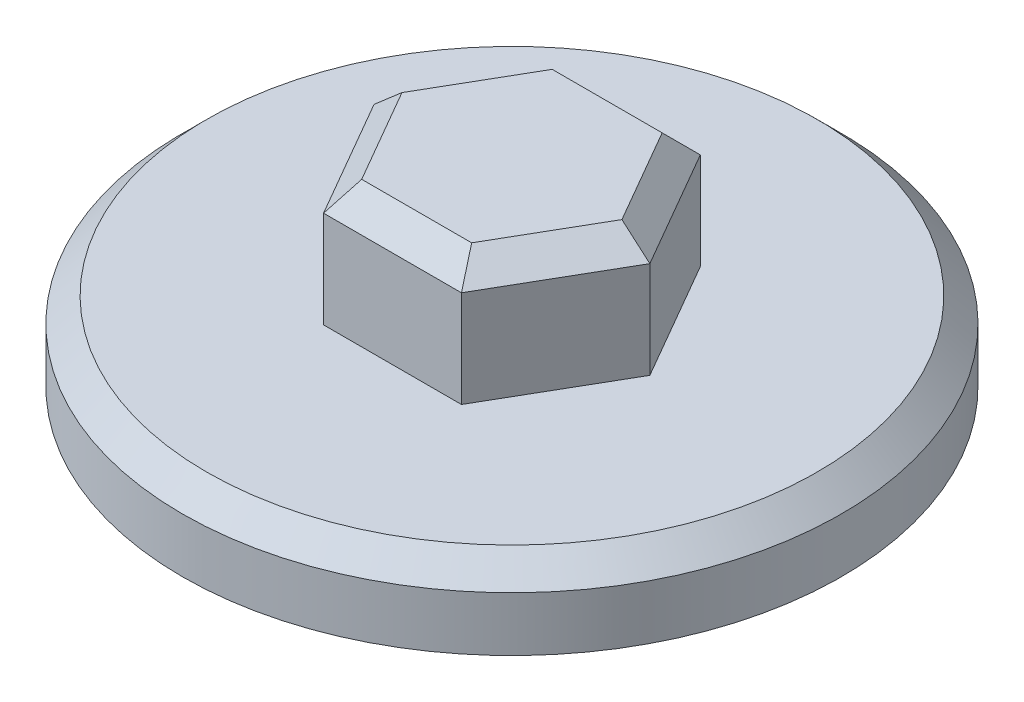
ISO-10303-21;
HEADER;
FILE_DESCRIPTION(('STEP AP214'),'2;1');
FILE_NAME('part.step','',(''),(''),'','','');
FILE_SCHEMA(('AUTOMOTIVE_DESIGN { 1 0 10303 214 1 1 1 1 }'));
ENDSEC;
DATA;
#1=APPLICATION_CONTEXT('core data for automotive mechanical design processes');
#2=APPLICATION_PROTOCOL_DEFINITION('international standard','automotive_design',2000,#1);
#3=PRODUCT_CONTEXT('',#1,'mechanical');
#4=PRODUCT('Part','Part','',(#3));
#5=PRODUCT_RELATED_PRODUCT_CATEGORY('part','',(#4));
#6=PRODUCT_DEFINITION_FORMATION('','',#4);
#7=PRODUCT_DEFINITION_CONTEXT('part definition',#1,'design');
#8=PRODUCT_DEFINITION('design','',#6,#7);
#9=PRODUCT_DEFINITION_SHAPE('','',#8);
#10=(LENGTH_UNIT() NAMED_UNIT(*) SI_UNIT(.MILLI.,.METRE.));
#11=(NAMED_UNIT(*) PLANE_ANGLE_UNIT() SI_UNIT($,.RADIAN.));
#12=(NAMED_UNIT(*) SI_UNIT($,.STERADIAN.) SOLID_ANGLE_UNIT());
#13=UNCERTAINTY_MEASURE_WITH_UNIT(LENGTH_MEASURE(1.E-05),#10,'distance_accuracy_value','');
#14=(GEOMETRIC_REPRESENTATION_CONTEXT(3) GLOBAL_UNCERTAINTY_ASSIGNED_CONTEXT((#13)) GLOBAL_UNIT_ASSIGNED_CONTEXT((#10,
#11,#12)) REPRESENTATION_CONTEXT('',''));
#15=CARTESIAN_POINT('',(0.,0.,0.));
#16=DIRECTION('',(0.,0.,1.));
#17=DIRECTION('',(1.,0.,0.));
#18=AXIS2_PLACEMENT_3D('',#15,#16,#17);
#19=CARTESIAN_POINT('',(0.,1.3,0.));
#20=DIRECTION('',(0.,-1.,0.));
#21=DIRECTION('',(0.,0.,-1.));
#22=AXIS2_PLACEMENT_3D('',#19,#20,#21);
#23=CYLINDRICAL_SURFACE('',#22,5.45);
#24=CARTESIAN_POINT('',(0.,0.899999999999997,0.));
#25=DIRECTION('',(0.,1.,0.));
#26=DIRECTION('',(0.,0.,1.));
#27=AXIS2_PLACEMENT_3D('',#24,#25,#26);
#28=CIRCLE('',#27,5.45);
#29=CARTESIAN_POINT('',(0.,0.899999999999997,5.45));
#30=VERTEX_POINT('',#29);
#31=EDGE_CURVE('E11',#30,#30,#28,.F.);
#32=ORIENTED_EDGE('',*,*,#31,.T.);
#33=EDGE_LOOP('',(#32));
#34=FACE_BOUND('',#33,.T.);
#35=CARTESIAN_POINT('',(0.,0.,0.));
#36=DIRECTION('',(0.,1.,0.));
#37=DIRECTION('',(0.,0.,1.));
#38=AXIS2_PLACEMENT_3D('',#35,#36,#37);
#39=CIRCLE('',#38,5.45);
#40=CARTESIAN_POINT('',(0.,0.,5.45));
#41=VERTEX_POINT('',#40);
#42=EDGE_CURVE('E173',#41,#41,#39,.T.);
#43=ORIENTED_EDGE('',*,*,#42,.T.);
#44=EDGE_LOOP('',(#43));
#45=FACE_BOUND('',#44,.T.);
#46=ADVANCED_FACE('F47',(#34,#45),#23,.T.);
#47=CARTESIAN_POINT('',(0.,1.3,0.));
#48=DIRECTION('',(0.,1.,0.));
#49=DIRECTION('',(0.,0.,1.));
#50=AXIS2_PLACEMENT_3D('',#47,#48,#49);
#51=PLANE('',#50);
#52=CARTESIAN_POINT('',(0.,1.3,0.));
#53=DIRECTION('',(0.,1.,0.));
#54=DIRECTION('',(0.,0.,1.));
#55=AXIS2_PLACEMENT_3D('',#52,#53,#54);
#56=CIRCLE('',#55,5.05);
#57=CARTESIAN_POINT('',(0.,1.3,5.05));
#58=VERTEX_POINT('',#57);
#59=EDGE_CURVE('E58',#58,#58,#56,.T.);
#60=ORIENTED_EDGE('',*,*,#59,.T.);
#61=EDGE_LOOP('',(#60));
#62=FACE_BOUND('',#61,.T.);
#63=DIRECTION('',(0.499999999999999,0.,-0.866025403784439));
#64=VECTOR('',#63,1.);
#65=CARTESIAN_POINT('',(1.14026678164951,1.3,1.975));
#66=LINE('',#65,#64);
#67=CARTESIAN_POINT('',(1.14026678164951,1.3,1.975));
#68=VERTEX_POINT('',#67);
#69=CARTESIAN_POINT('',(2.28053356329902,1.3,0.));
#70=VERTEX_POINT('',#69);
#71=EDGE_CURVE('E145',#68,#70,#66,.T.);
#72=ORIENTED_EDGE('',*,*,#71,.F.);
#73=DIRECTION('',(1.,0.,0.));
#74=VECTOR('',#73,1.);
#75=CARTESIAN_POINT('',(-1.14026678164951,1.3,1.975));
#76=LINE('',#75,#74);
#77=CARTESIAN_POINT('',(-1.14026678164951,1.3,1.975));
#78=VERTEX_POINT('',#77);
#79=EDGE_CURVE('E156',#78,#68,#76,.T.);
#80=ORIENTED_EDGE('',*,*,#79,.F.);
#81=DIRECTION('',(0.5,0.,0.866025403784439));
#82=VECTOR('',#81,1.);
#83=CARTESIAN_POINT('',(-2.28053356329902,1.3,0.));
#84=LINE('',#83,#82);
#85=CARTESIAN_POINT('',(-2.28053356329902,1.3,0.));
#86=VERTEX_POINT('',#85);
#87=EDGE_CURVE('E152',#86,#78,#84,.T.);
#88=ORIENTED_EDGE('',*,*,#87,.F.);
#89=DIRECTION('',(-0.5,0.,0.866025403784439));
#90=VECTOR('',#89,1.);
#91=CARTESIAN_POINT('',(-1.14026678164951,1.3,-1.975));
#92=LINE('',#91,#90);
#93=CARTESIAN_POINT('',(-1.14026678164951,1.3,-1.975));
#94=VERTEX_POINT('',#93);
#95=EDGE_CURVE('E140',#94,#86,#92,.T.);
#96=ORIENTED_EDGE('',*,*,#95,.F.);
#97=DIRECTION('',(-1.,0.,0.));
#98=VECTOR('',#97,1.);
#99=CARTESIAN_POINT('',(1.14026678164951,1.3,-1.975));
#100=LINE('',#99,#98);
#101=CARTESIAN_POINT('',(1.14026678164951,1.3,-1.975));
#102=VERTEX_POINT('',#101);
#103=EDGE_CURVE('E124',#102,#94,#100,.T.);
#104=ORIENTED_EDGE('',*,*,#103,.F.);
#105=DIRECTION('',(-0.5,0.,-0.866025403784439));
#106=VECTOR('',#105,1.);
#107=CARTESIAN_POINT('',(2.28053356329902,1.3,0.));
#108=LINE('',#107,#106);
#109=EDGE_CURVE('E136',#70,#102,#108,.T.);
#110=ORIENTED_EDGE('',*,*,#109,.F.);
#111=EDGE_LOOP('',(#72,#80,#88,#96,#104,#110));
#112=FACE_BOUND('',#111,.T.);
#113=ADVANCED_FACE('F135',(#62,#112),#51,.T.);
#114=CARTESIAN_POINT('',(0.,0.,0.));
#115=DIRECTION('',(0.,1.,0.));
#116=DIRECTION('',(0.,0.,1.));
#117=AXIS2_PLACEMENT_3D('',#114,#115,#116);
#118=PLANE('',#117);
#119=ORIENTED_EDGE('',*,*,#42,.F.);
#120=EDGE_LOOP('',(#119));
#121=FACE_BOUND('',#120,.T.);
#122=ADVANCED_FACE('F288',(#121),#118,.F.);
#123=CARTESIAN_POINT('',(1.14026678164951,3.3,1.975));
#124=DIRECTION('',(-0.866025403784439,0.,-0.499999999999999));
#125=DIRECTION('',(-0.499999999999999,0.,0.866025403784439));
#126=AXIS2_PLACEMENT_3D('',#123,#124,#125);
#127=PLANE('',#126);
#128=DIRECTION('',(0.,-1.,0.));
#129=VECTOR('',#128,1.);
#130=CARTESIAN_POINT('',(2.28053356329902,3.3,0.));
#131=LINE('',#130,#129);
#132=CARTESIAN_POINT('',(2.28053356329902,2.9,0.));
#133=VERTEX_POINT('',#132);
#134=EDGE_CURVE('E128',#133,#70,#131,.T.);
#135=ORIENTED_EDGE('',*,*,#134,.F.);
#136=DIRECTION('',(-0.499999999999999,0.,0.866025403784439));
#137=VECTOR('',#136,1.);
#138=CARTESIAN_POINT('',(1.14026678164951,2.9,1.975));
#139=LINE('',#138,#137);
#140=CARTESIAN_POINT('',(1.14026678164951,2.9,1.975));
#141=VERTEX_POINT('',#140);
#142=EDGE_CURVE('E210',#133,#141,#139,.T.);
#143=ORIENTED_EDGE('',*,*,#142,.T.);
#144=DIRECTION('',(0.,-1.,0.));
#145=VECTOR('',#144,1.);
#146=CARTESIAN_POINT('',(1.14026678164951,3.3,1.975));
#147=LINE('',#146,#145);
#148=EDGE_CURVE('E160',#141,#68,#147,.T.);
#149=ORIENTED_EDGE('',*,*,#148,.T.);
#150=ORIENTED_EDGE('',*,*,#71,.T.);
#151=EDGE_LOOP('',(#135,#143,#149,#150));
#152=FACE_BOUND('',#151,.T.);
#153=ADVANCED_FACE('F254',(#152),#127,.F.);
#154=CARTESIAN_POINT('',(2.28053356329902,3.3,0.));
#155=DIRECTION('',(-0.866025403784439,0.,0.5));
#156=DIRECTION('',(0.5,0.,0.866025403784439));
#157=AXIS2_PLACEMENT_3D('',#154,#155,#156);
#158=PLANE('',#157);
#159=DIRECTION('',(0.,-1.,0.));
#160=VECTOR('',#159,1.);
#161=CARTESIAN_POINT('',(1.14026678164951,3.3,-1.975));
#162=LINE('',#161,#160);
#163=CARTESIAN_POINT('',(1.14026678164951,2.9,-1.975));
#164=VERTEX_POINT('',#163);
#165=EDGE_CURVE('E121',#164,#102,#162,.T.);
#166=ORIENTED_EDGE('',*,*,#165,.F.);
#167=DIRECTION('',(0.5,0.,0.866025403784439));
#168=VECTOR('',#167,1.);
#169=CARTESIAN_POINT('',(2.28053356329902,2.9,0.));
#170=LINE('',#169,#168);
#171=EDGE_CURVE('E66',#164,#133,#170,.T.);
#172=ORIENTED_EDGE('',*,*,#171,.T.);
#173=ORIENTED_EDGE('',*,*,#134,.T.);
#174=ORIENTED_EDGE('',*,*,#109,.T.);
#175=EDGE_LOOP('',(#166,#172,#173,#174));
#176=FACE_BOUND('',#175,.T.);
#177=ADVANCED_FACE('F143',(#176),#158,.F.);
#178=CARTESIAN_POINT('',(1.14026678164951,3.3,-1.975));
#179=DIRECTION('',(0.,0.,1.));
#180=DIRECTION('',(1.,0.,0.));
#181=AXIS2_PLACEMENT_3D('',#178,#179,#180);
#182=PLANE('',#181);
#183=DIRECTION('',(0.,-1.,0.));
#184=VECTOR('',#183,1.);
#185=CARTESIAN_POINT('',(-1.14026678164951,3.3,-1.975));
#186=LINE('',#185,#184);
#187=CARTESIAN_POINT('',(-1.14026678164951,2.9,-1.975));
#188=VERTEX_POINT('',#187);
#189=EDGE_CURVE('E129',#188,#94,#186,.T.);
#190=ORIENTED_EDGE('',*,*,#189,.F.);
#191=DIRECTION('',(1.,0.,0.));
#192=VECTOR('',#191,1.);
#193=CARTESIAN_POINT('',(1.14026678164951,2.9,-1.975));
#194=LINE('',#193,#192);
#195=EDGE_CURVE('E74',#188,#164,#194,.T.);
#196=ORIENTED_EDGE('',*,*,#195,.T.);
#197=ORIENTED_EDGE('',*,*,#165,.T.);
#198=ORIENTED_EDGE('',*,*,#103,.T.);
#199=EDGE_LOOP('',(#190,#196,#197,#198));
#200=FACE_BOUND('',#199,.T.);
#201=ADVANCED_FACE('F123',(#200),#182,.F.);
#202=CARTESIAN_POINT('',(-1.14026678164951,3.3,-1.975));
#203=DIRECTION('',(0.866025403784439,0.,0.5));
#204=DIRECTION('',(0.5,0.,-0.866025403784439));
#205=AXIS2_PLACEMENT_3D('',#202,#203,#204);
#206=PLANE('',#205);
#207=DIRECTION('',(0.,-1.,0.));
#208=VECTOR('',#207,1.);
#209=CARTESIAN_POINT('',(-2.28053356329902,3.3,0.));
#210=LINE('',#209,#208);
#211=CARTESIAN_POINT('',(-2.28053356329902,2.9,0.));
#212=VERTEX_POINT('',#211);
#213=EDGE_CURVE('E166',#212,#86,#210,.T.);
#214=ORIENTED_EDGE('',*,*,#213,.F.);
#215=DIRECTION('',(0.5,0.,-0.866025403784439));
#216=VECTOR('',#215,1.);
#217=CARTESIAN_POINT('',(-1.14026678164951,2.9,-1.975));
#218=LINE('',#217,#216);
#219=EDGE_CURVE('E203',#212,#188,#218,.T.);
#220=ORIENTED_EDGE('',*,*,#219,.T.);
#221=ORIENTED_EDGE('',*,*,#189,.T.);
#222=ORIENTED_EDGE('',*,*,#95,.T.);
#223=EDGE_LOOP('',(#214,#220,#221,#222));
#224=FACE_BOUND('',#223,.T.);
#225=ADVANCED_FACE('F272',(#224),#206,.F.);
#226=CARTESIAN_POINT('',(-2.28053356329902,3.3,0.));
#227=DIRECTION('',(0.866025403784439,0.,-0.5));
#228=DIRECTION('',(-0.5,0.,-0.866025403784439));
#229=AXIS2_PLACEMENT_3D('',#226,#227,#228);
#230=PLANE('',#229);
#231=DIRECTION('',(0.,-1.,0.));
#232=VECTOR('',#231,1.);
#233=CARTESIAN_POINT('',(-1.14026678164951,3.3,1.975));
#234=LINE('',#233,#232);
#235=CARTESIAN_POINT('',(-1.14026678164951,2.9,1.975));
#236=VERTEX_POINT('',#235);
#237=EDGE_CURVE('E163',#236,#78,#234,.T.);
#238=ORIENTED_EDGE('',*,*,#237,.F.);
#239=DIRECTION('',(-0.5,0.,-0.866025403784439));
#240=VECTOR('',#239,1.);
#241=CARTESIAN_POINT('',(-2.28053356329902,2.9,0.));
#242=LINE('',#241,#240);
#243=EDGE_CURVE('E200',#236,#212,#242,.T.);
#244=ORIENTED_EDGE('',*,*,#243,.T.);
#245=ORIENTED_EDGE('',*,*,#213,.T.);
#246=ORIENTED_EDGE('',*,*,#87,.T.);
#247=EDGE_LOOP('',(#238,#244,#245,#246));
#248=FACE_BOUND('',#247,.T.);
#249=ADVANCED_FACE('F270',(#248),#230,.F.);
#250=CARTESIAN_POINT('',(-1.14026678164951,3.3,1.975));
#251=DIRECTION('',(0.,0.,-1.));
#252=DIRECTION('',(-1.,0.,0.));
#253=AXIS2_PLACEMENT_3D('',#250,#251,#252);
#254=PLANE('',#253);
#255=ORIENTED_EDGE('',*,*,#148,.F.);
#256=DIRECTION('',(-1.,0.,0.));
#257=VECTOR('',#256,1.);
#258=CARTESIAN_POINT('',(-1.14026678164951,2.9,1.975));
#259=LINE('',#258,#257);
#260=EDGE_CURVE('E196',#141,#236,#259,.T.);
#261=ORIENTED_EDGE('',*,*,#260,.T.);
#262=ORIENTED_EDGE('',*,*,#237,.T.);
#263=ORIENTED_EDGE('',*,*,#79,.T.);
#264=EDGE_LOOP('',(#255,#261,#262,#263));
#265=FACE_BOUND('',#264,.T.);
#266=ADVANCED_FACE('F257',(#265),#254,.F.);
#267=CARTESIAN_POINT('',(0.,3.3,0.));
#268=DIRECTION('',(0.,1.,0.));
#269=DIRECTION('',(0.,0.,1.));
#270=AXIS2_PLACEMENT_3D('',#267,#268,#269);
#271=PLANE('',#270);
#272=DIRECTION('',(0.5,0.,0.866025403784439));
#273=VECTOR('',#272,1.);
#274=CARTESIAN_POINT('',(-0.793856620135733,3.3,1.775));
#275=LINE('',#274,#273);
#276=CARTESIAN_POINT('',(-1.81865334794732,3.3,0.));
#277=VERTEX_POINT('',#276);
#278=CARTESIAN_POINT('',(-0.909326673973659,3.3,1.575));
#279=VERTEX_POINT('',#278);
#280=EDGE_CURVE('E189',#277,#279,#275,.T.);
#281=ORIENTED_EDGE('',*,*,#280,.T.);
#282=DIRECTION('',(1.,0.,0.));
#283=VECTOR('',#282,1.);
#284=CARTESIAN_POINT('',(1.14026678164951,3.3,1.575));
#285=LINE('',#284,#283);
#286=CARTESIAN_POINT('',(0.909326673973659,3.3,1.575));
#287=VERTEX_POINT('',#286);
#288=EDGE_CURVE('E192',#279,#287,#285,.T.);
#289=ORIENTED_EDGE('',*,*,#288,.T.);
#290=DIRECTION('',(0.499999999999999,0.,-0.866025403784439));
#291=VECTOR('',#290,1.);
#292=CARTESIAN_POINT('',(1.93412340178524,3.3,-0.200000000000002));
#293=LINE('',#292,#291);
#294=CARTESIAN_POINT('',(1.81865334794732,3.3,0.));
#295=VERTEX_POINT('',#294);
#296=EDGE_CURVE('E177',#287,#295,#293,.T.);
#297=ORIENTED_EDGE('',*,*,#296,.T.);
#298=DIRECTION('',(-0.5,0.,-0.866025403784439));
#299=VECTOR('',#298,1.);
#300=CARTESIAN_POINT('',(0.793856620135731,3.3,-1.775));
#301=LINE('',#300,#299);
#302=CARTESIAN_POINT('',(0.909326673973657,3.3,-1.575));
#303=VERTEX_POINT('',#302);
#304=EDGE_CURVE('E180',#295,#303,#301,.T.);
#305=ORIENTED_EDGE('',*,*,#304,.T.);
#306=DIRECTION('',(-1.,0.,0.));
#307=VECTOR('',#306,1.);
#308=CARTESIAN_POINT('',(-1.14026678164951,3.3,-1.575));
#309=LINE('',#308,#307);
#310=CARTESIAN_POINT('',(-0.909326673973659,3.3,-1.575));
#311=VERTEX_POINT('',#310);
#312=EDGE_CURVE('E183',#303,#311,#309,.T.);
#313=ORIENTED_EDGE('',*,*,#312,.T.);
#314=DIRECTION('',(-0.5,0.,0.866025403784439));
#315=VECTOR('',#314,1.);
#316=CARTESIAN_POINT('',(-1.93412340178524,3.3,0.200000000000002));
#317=LINE('',#316,#315);
#318=EDGE_CURVE('E186',#311,#277,#317,.T.);
#319=ORIENTED_EDGE('',*,*,#318,.T.);
#320=EDGE_LOOP('',(#281,#289,#297,#305,#313,#319));
#321=FACE_BOUND('',#320,.T.);
#322=ADVANCED_FACE('F322',(#321),#271,.T.);
#323=CARTESIAN_POINT('',(0.,3.3,-1.575));
#324=DIRECTION('',(0.,0.707106781186548,-0.707106781186547));
#325=DIRECTION('',(1.,0.,0.));
#326=AXIS2_PLACEMENT_3D('',#323,#324,#325);
#327=PLANE('',#326);
#328=DIRECTION('',(-0.377964473009227,0.654653670707977,0.654653670707977));
#329=VECTOR('',#328,1.);
#330=CARTESIAN_POINT('',(0.779422863405991,3.525,-1.35));
#331=LINE('',#330,#329);
#332=EDGE_CURVE('E229',#164,#303,#331,.T.);
#333=ORIENTED_EDGE('',*,*,#332,.F.);
#334=ORIENTED_EDGE('',*,*,#195,.F.);
#335=DIRECTION('',(0.377964473009227,0.654653670707977,0.654653670707977));
#336=VECTOR('',#335,1.);
#337=CARTESIAN_POINT('',(-0.779422863405993,3.525,-1.35));
#338=LINE('',#337,#336);
#339=EDGE_CURVE('E52',#311,#188,#338,.F.);
#340=ORIENTED_EDGE('',*,*,#339,.F.);
#341=ORIENTED_EDGE('',*,*,#312,.F.);
#342=EDGE_LOOP('',(#333,#334,#340,#341));
#343=FACE_BOUND('',#342,.T.);
#344=ADVANCED_FACE('F244',(#343),#327,.T.);
#345=CARTESIAN_POINT('',(-1.36399001096049,3.3,-0.787499999999999));
#346=DIRECTION('',(-0.612372435695794,0.707106781186548,-0.353553390593274));
#347=DIRECTION('',(0.5,0.,-0.866025403784439));
#348=AXIS2_PLACEMENT_3D('',#345,#346,#347);
#349=PLANE('',#348);
#350=ORIENTED_EDGE('',*,*,#339,.T.);
#351=ORIENTED_EDGE('',*,*,#219,.F.);
#352=DIRECTION('',(0.755928946018455,0.654653670707977,0.));
#353=VECTOR('',#352,1.);
#354=CARTESIAN_POINT('',(-1.55884572681199,3.525,0.));
#355=LINE('',#354,#353);
#356=EDGE_CURVE('E226',#277,#212,#355,.F.);
#357=ORIENTED_EDGE('',*,*,#356,.F.);
#358=ORIENTED_EDGE('',*,*,#318,.F.);
#359=EDGE_LOOP('',(#350,#351,#357,#358));
#360=FACE_BOUND('',#359,.T.);
#361=ADVANCED_FACE('F240',(#360),#349,.T.);
#362=CARTESIAN_POINT('',(1.36399001096049,3.3,-0.787499999999998));
#363=DIRECTION('',(0.612372435695794,0.707106781186548,-0.353553390593274));
#364=DIRECTION('',(0.5,0.,0.866025403784439));
#365=AXIS2_PLACEMENT_3D('',#362,#363,#364);
#366=PLANE('',#365);
#367=ORIENTED_EDGE('',*,*,#332,.T.);
#368=ORIENTED_EDGE('',*,*,#304,.F.);
#369=DIRECTION('',(-0.755928946018455,0.654653670707977,0.));
#370=VECTOR('',#369,1.);
#371=CARTESIAN_POINT('',(1.55884572681199,3.525,0.));
#372=LINE('',#371,#370);
#373=EDGE_CURVE('E222',#133,#295,#372,.T.);
#374=ORIENTED_EDGE('',*,*,#373,.F.);
#375=ORIENTED_EDGE('',*,*,#171,.F.);
#376=EDGE_LOOP('',(#367,#368,#374,#375));
#377=FACE_BOUND('',#376,.T.);
#378=ADVANCED_FACE('F246',(#377),#366,.T.);
#379=CARTESIAN_POINT('',(-1.36399001096049,3.3,0.787499999999999));
#380=DIRECTION('',(-0.612372435695794,0.707106781186548,0.353553390593274));
#381=DIRECTION('',(-0.5,0.,-0.866025403784439));
#382=AXIS2_PLACEMENT_3D('',#379,#380,#381);
#383=PLANE('',#382);
#384=ORIENTED_EDGE('',*,*,#356,.T.);
#385=ORIENTED_EDGE('',*,*,#243,.F.);
#386=DIRECTION('',(0.377964473009227,0.654653670707977,-0.654653670707977));
#387=VECTOR('',#386,1.);
#388=CARTESIAN_POINT('',(-0.779422863405994,3.525,1.35));
#389=LINE('',#388,#387);
#390=EDGE_CURVE('E219',#279,#236,#389,.F.);
#391=ORIENTED_EDGE('',*,*,#390,.F.);
#392=ORIENTED_EDGE('',*,*,#280,.F.);
#393=EDGE_LOOP('',(#384,#385,#391,#392));
#394=FACE_BOUND('',#393,.T.);
#395=ADVANCED_FACE('F267',(#394),#383,.T.);
#396=CARTESIAN_POINT('',(1.36399001096049,3.3,0.787499999999997));
#397=DIRECTION('',(0.612372435695794,0.707106781186548,0.353553390593273));
#398=DIRECTION('',(-0.499999999999999,0.,0.866025403784439));
#399=AXIS2_PLACEMENT_3D('',#396,#397,#398);
#400=PLANE('',#399);
#401=ORIENTED_EDGE('',*,*,#373,.T.);
#402=ORIENTED_EDGE('',*,*,#296,.F.);
#403=DIRECTION('',(0.377964473009228,-0.654653670707977,0.654653670707977));
#404=VECTOR('',#403,1.);
#405=CARTESIAN_POINT('',(0.779422863405993,3.525,1.35));
#406=LINE('',#405,#404);
#407=EDGE_CURVE('E216',#141,#287,#406,.F.);
#408=ORIENTED_EDGE('',*,*,#407,.F.);
#409=ORIENTED_EDGE('',*,*,#142,.F.);
#410=EDGE_LOOP('',(#401,#402,#408,#409));
#411=FACE_BOUND('',#410,.T.);
#412=ADVANCED_FACE('F251',(#411),#400,.T.);
#413=CARTESIAN_POINT('',(0.,3.3,1.575));
#414=DIRECTION('',(0.,0.707106781186548,0.707106781186547));
#415=DIRECTION('',(-1.,0.,0.));
#416=AXIS2_PLACEMENT_3D('',#413,#414,#415);
#417=PLANE('',#416);
#418=ORIENTED_EDGE('',*,*,#390,.T.);
#419=ORIENTED_EDGE('',*,*,#260,.F.);
#420=ORIENTED_EDGE('',*,*,#407,.T.);
#421=ORIENTED_EDGE('',*,*,#288,.F.);
#422=EDGE_LOOP('',(#418,#419,#420,#421));
#423=FACE_BOUND('',#422,.T.);
#424=ADVANCED_FACE('F261',(#423),#417,.T.);
#425=CARTESIAN_POINT('',(0.,1.3,0.));
#426=DIRECTION('',(0.,-1.,0.));
#427=DIRECTION('',(0.,0.,-1.));
#428=AXIS2_PLACEMENT_3D('',#425,#426,#427);
#429=CONICAL_SURFACE('',#428,5.05,0.785398163397444);
#430=ORIENTED_EDGE('',*,*,#31,.F.);
#431=EDGE_LOOP('',(#430));
#432=FACE_BOUND('',#431,.T.);
#433=ORIENTED_EDGE('',*,*,#59,.F.);
#434=EDGE_LOOP('',(#433));
#435=FACE_BOUND('',#434,.T.);
#436=ADVANCED_FACE('F50',(#432,#435),#429,.T.);
#437=CLOSED_SHELL('',(#46,#113,#122,#153,#177,#201,#225,#249,#266,#322,#344,#361,#378,#395,#412,
#424,#436));
#438=MANIFOLD_SOLID_BREP('B2',#437);
#439=ADVANCED_BREP_SHAPE_REPRESENTATION('',(#18,#438),#14);
#440=SHAPE_DEFINITION_REPRESENTATION(#9,#439);
ENDSEC;
END-ISO-10303-21;
